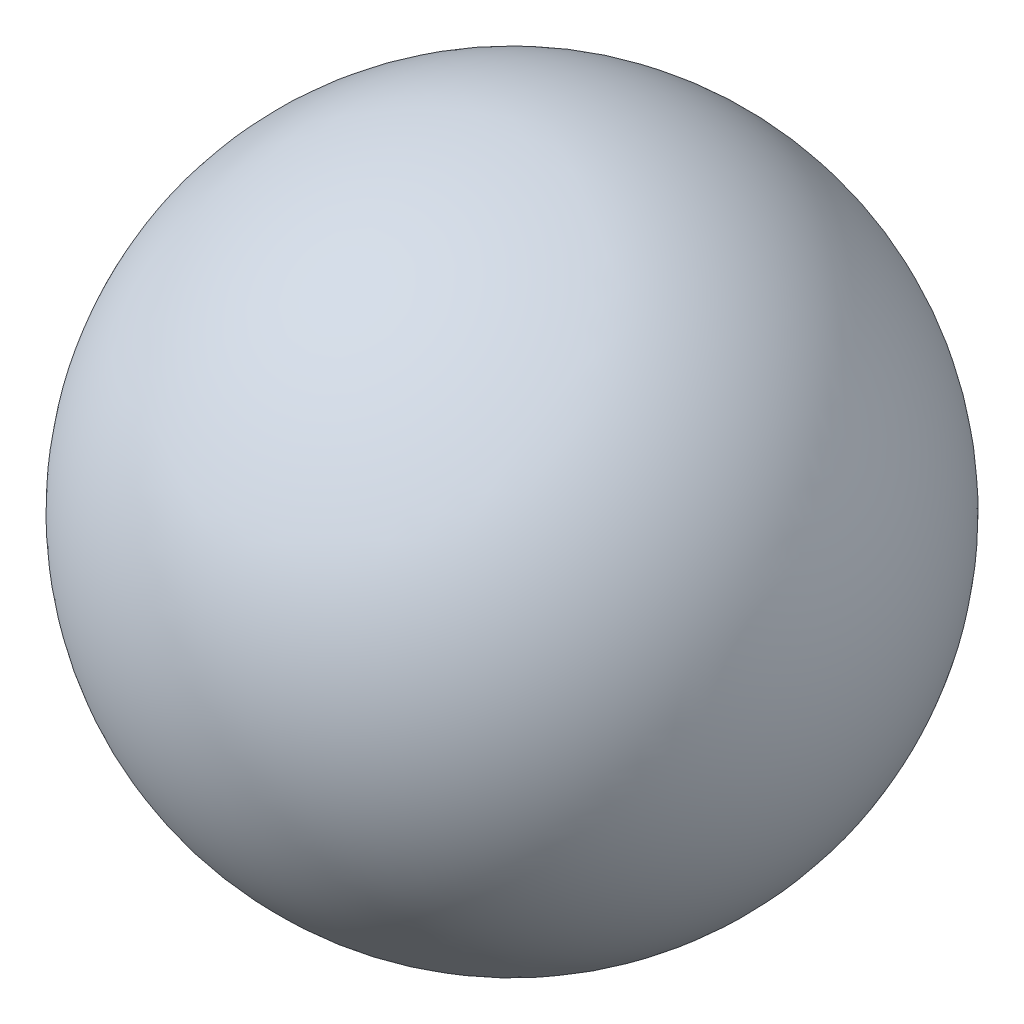
ISO-10303-21;
HEADER;
FILE_DESCRIPTION(('STEP AP214'),'2;1');
FILE_NAME('part.step','',(''),(''),'','','');
FILE_SCHEMA(('AUTOMOTIVE_DESIGN { 1 0 10303 214 1 1 1 1 }'));
ENDSEC;
DATA;
#1=APPLICATION_CONTEXT('core data for automotive mechanical design processes');
#2=APPLICATION_PROTOCOL_DEFINITION('international standard','automotive_design',2000,#1);
#3=PRODUCT_CONTEXT('',#1,'mechanical');
#4=PRODUCT('Part','Part','',(#3));
#5=PRODUCT_RELATED_PRODUCT_CATEGORY('part','',(#4));
#6=PRODUCT_DEFINITION_FORMATION('','',#4);
#7=PRODUCT_DEFINITION_CONTEXT('part definition',#1,'design');
#8=PRODUCT_DEFINITION('design','',#6,#7);
#9=PRODUCT_DEFINITION_SHAPE('','',#8);
#10=(LENGTH_UNIT() NAMED_UNIT(*) SI_UNIT(.MILLI.,.METRE.));
#11=(NAMED_UNIT(*) PLANE_ANGLE_UNIT() SI_UNIT($,.RADIAN.));
#12=(NAMED_UNIT(*) SI_UNIT($,.STERADIAN.) SOLID_ANGLE_UNIT());
#13=UNCERTAINTY_MEASURE_WITH_UNIT(LENGTH_MEASURE(1.E-05),#10,'distance_accuracy_value','');
#14=(GEOMETRIC_REPRESENTATION_CONTEXT(3) GLOBAL_UNCERTAINTY_ASSIGNED_CONTEXT((#13)) GLOBAL_UNIT_ASSIGNED_CONTEXT((#10,
#11,#12)) REPRESENTATION_CONTEXT('',''));
#15=CARTESIAN_POINT('',(0.,0.,0.));
#16=DIRECTION('',(0.,0.,1.));
#17=DIRECTION('',(1.,0.,0.));
#18=AXIS2_PLACEMENT_3D('',#15,#16,#17);
#19=CARTESIAN_POINT('',(3.7,0.,-3.7));
#20=DIRECTION('',(-1.,0.,0.));
#21=DIRECTION('',(0.,0.,-1.));
#22=AXIS2_PLACEMENT_3D('',#19,#20,#21);
#23=SPHERICAL_SURFACE('',#22,2.4);
#24=CARTESIAN_POINT('',(1.3,0.,-3.7));
#25=VERTEX_POINT('',#24);
#26=VERTEX_LOOP('',#25);
#27=FACE_BOUND('',#26,.T.);
#28=ADVANCED_FACE('F27',(#27),#23,.T.);
#29=CLOSED_SHELL('',(#28));
#30=MANIFOLD_SOLID_BREP('B2',#29);
#31=ADVANCED_BREP_SHAPE_REPRESENTATION('',(#18,#30),#14);
#32=SHAPE_DEFINITION_REPRESENTATION(#9,#31);
ENDSEC;
END-ISO-10303-21;
